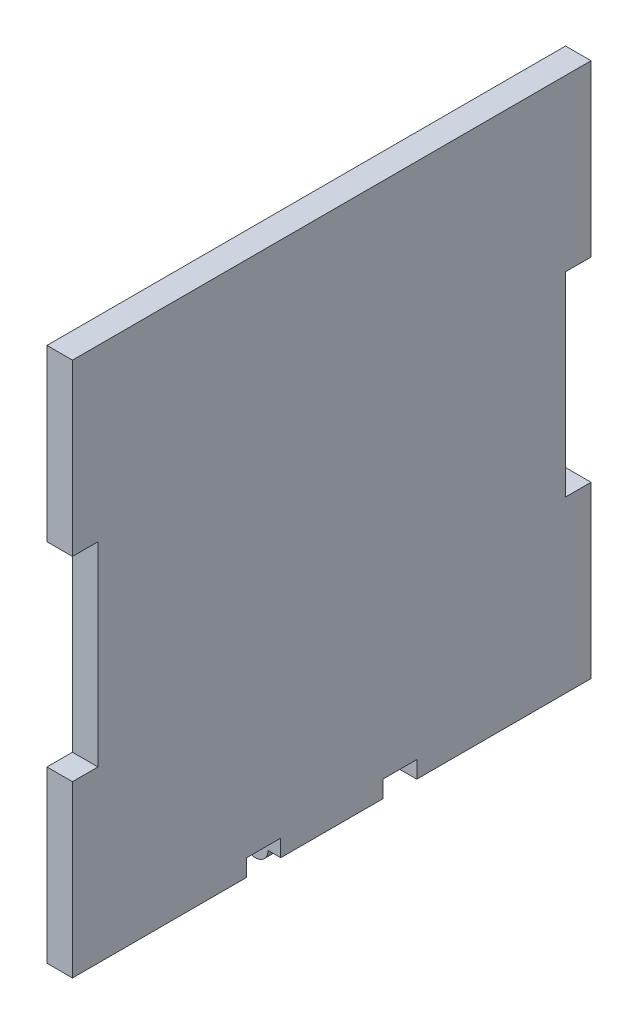
ISO-10303-21;
HEADER;
FILE_DESCRIPTION(('STEP AP214'),'2;1');
FILE_NAME('part.step','',(''),(''),'','','');
FILE_SCHEMA(('AUTOMOTIVE_DESIGN { 1 0 10303 214 1 1 1 1 }'));
ENDSEC;
DATA;
#1=APPLICATION_CONTEXT('core data for automotive mechanical design processes');
#2=APPLICATION_PROTOCOL_DEFINITION('international standard','automotive_design',2000,#1);
#3=PRODUCT_CONTEXT('',#1,'mechanical');
#4=PRODUCT('Part','Part','',(#3));
#5=PRODUCT_RELATED_PRODUCT_CATEGORY('part','',(#4));
#6=PRODUCT_DEFINITION_FORMATION('','',#4);
#7=PRODUCT_DEFINITION_CONTEXT('part definition',#1,'design');
#8=PRODUCT_DEFINITION('design','',#6,#7);
#9=PRODUCT_DEFINITION_SHAPE('','',#8);
#10=(LENGTH_UNIT() NAMED_UNIT(*) SI_UNIT(.MILLI.,.METRE.));
#11=(NAMED_UNIT(*) PLANE_ANGLE_UNIT() SI_UNIT($,.RADIAN.));
#12=(NAMED_UNIT(*) SI_UNIT($,.STERADIAN.) SOLID_ANGLE_UNIT());
#13=UNCERTAINTY_MEASURE_WITH_UNIT(LENGTH_MEASURE(1.E-05),#10,'distance_accuracy_value','');
#14=(GEOMETRIC_REPRESENTATION_CONTEXT(3) GLOBAL_UNCERTAINTY_ASSIGNED_CONTEXT((#13)) GLOBAL_UNIT_ASSIGNED_CONTEXT((#10,
#11,#12)) REPRESENTATION_CONTEXT('',''));
#15=CARTESIAN_POINT('',(0.,0.,0.));
#16=DIRECTION('',(0.,0.,1.));
#17=DIRECTION('',(1.,0.,0.));
#18=AXIS2_PLACEMENT_3D('',#15,#16,#17);
#19=CARTESIAN_POINT('',(3.,0.,27.5));
#20=DIRECTION('',(0.,1.,0.));
#21=DIRECTION('',(0.,0.,1.));
#22=AXIS2_PLACEMENT_3D('',#19,#20,#21);
#23=PLANE('',#22);
#24=DIRECTION('',(0.,0.,-1.));
#25=VECTOR('',#24,1.);
#26=CARTESIAN_POINT('',(1.49999999999999,0.,-3.));
#27=LINE('',#26,#25);
#28=CARTESIAN_POINT('',(1.49999999999999,0.,-6.));
#29=VERTEX_POINT('',#28);
#30=CARTESIAN_POINT('',(1.49999999999999,0.,-3.));
#31=VERTEX_POINT('',#30);
#32=EDGE_CURVE('E195',#29,#31,#27,.F.);
#33=ORIENTED_EDGE('',*,*,#32,.F.);
#34=DIRECTION('',(-1.,0.,0.));
#35=VECTOR('',#34,1.);
#36=CARTESIAN_POINT('',(10.,0.,-6.));
#37=LINE('',#36,#35);
#38=CARTESIAN_POINT('',(3.,0.,-6.));
#39=VERTEX_POINT('',#38);
#40=EDGE_CURVE('E249',#39,#29,#37,.T.);
#41=ORIENTED_EDGE('',*,*,#40,.F.);
#42=DIRECTION('',(0.,0.,-1.));
#43=VECTOR('',#42,1.);
#44=CARTESIAN_POINT('',(3.,0.,-27.5));
#45=LINE('',#44,#43);
#46=CARTESIAN_POINT('',(3.,0.,6.));
#47=VERTEX_POINT('',#46);
#48=EDGE_CURVE('E273',#47,#39,#45,.T.);
#49=ORIENTED_EDGE('',*,*,#48,.F.);
#50=DIRECTION('',(-1.,0.,0.));
#51=VECTOR('',#50,1.);
#52=CARTESIAN_POINT('',(10.,0.,6.));
#53=LINE('',#52,#51);
#54=CARTESIAN_POINT('',(1.49999999999999,0.,6.));
#55=VERTEX_POINT('',#54);
#56=EDGE_CURVE('E222',#47,#55,#53,.T.);
#57=ORIENTED_EDGE('',*,*,#56,.T.);
#58=DIRECTION('',(0.,0.,-1.));
#59=VECTOR('',#58,1.);
#60=CARTESIAN_POINT('',(1.49999999999999,0.,6.));
#61=LINE('',#60,#59);
#62=CARTESIAN_POINT('',(1.49999999999999,0.,3.));
#63=VERTEX_POINT('',#62);
#64=EDGE_CURVE('E56',#63,#55,#61,.F.);
#65=ORIENTED_EDGE('',*,*,#64,.F.);
#66=DIRECTION('',(1.,0.,0.));
#67=VECTOR('',#66,1.);
#68=CARTESIAN_POINT('',(3.,0.,3.));
#69=LINE('',#68,#67);
#70=CARTESIAN_POINT('',(0.,0.,3.));
#71=VERTEX_POINT('',#70);
#72=EDGE_CURVE('E263',#71,#63,#69,.T.);
#73=ORIENTED_EDGE('',*,*,#72,.F.);
#74=DIRECTION('',(0.,0.,-1.));
#75=VECTOR('',#74,1.);
#76=CARTESIAN_POINT('',(0.,0.,27.5));
#77=LINE('',#76,#75);
#78=CARTESIAN_POINT('',(0.,0.,-3.));
#79=VERTEX_POINT('',#78);
#80=EDGE_CURVE('E209',#71,#79,#77,.T.);
#81=ORIENTED_EDGE('',*,*,#80,.T.);
#82=DIRECTION('',(1.,0.,0.));
#83=VECTOR('',#82,1.);
#84=CARTESIAN_POINT('',(3.,0.,-3.));
#85=LINE('',#84,#83);
#86=EDGE_CURVE('E202',#79,#31,#85,.T.);
#87=ORIENTED_EDGE('',*,*,#86,.T.);
#88=EDGE_LOOP('',(#33,#41,#49,#57,#65,#73,#81,#87));
#89=FACE_BOUND('',#88,.T.);
#90=ADVANCED_FACE('F33',(#89),#23,.F.);
#91=CARTESIAN_POINT('',(0.,0.,0.));
#92=DIRECTION('',(1.,0.,0.));
#93=DIRECTION('',(0.,0.,-1.));
#94=AXIS2_PLACEMENT_3D('',#91,#92,#93);
#95=PLANE('',#94);
#96=DIRECTION('',(0.,0.,-1.));
#97=VECTOR('',#96,1.);
#98=CARTESIAN_POINT('',(0.,1.5,-3.));
#99=LINE('',#98,#97);
#100=CARTESIAN_POINT('',(0.,1.5,-3.));
#101=VERTEX_POINT('',#100);
#102=CARTESIAN_POINT('',(0.,1.5,-6.));
#103=VERTEX_POINT('',#102);
#104=EDGE_CURVE('E203',#101,#103,#99,.T.);
#105=ORIENTED_EDGE('',*,*,#104,.F.);
#106=DIRECTION('',(0.,-1.,0.));
#107=VECTOR('',#106,1.);
#108=CARTESIAN_POINT('',(0.,0.,-3.));
#109=LINE('',#108,#107);
#110=EDGE_CURVE('E11',#101,#79,#109,.T.);
#111=ORIENTED_EDGE('',*,*,#110,.T.);
#112=ORIENTED_EDGE('',*,*,#80,.F.);
#113=DIRECTION('',(0.,-1.,0.));
#114=VECTOR('',#113,1.);
#115=CARTESIAN_POINT('',(0.,0.,3.));
#116=LINE('',#115,#114);
#117=CARTESIAN_POINT('',(0.,1.5,3.));
#118=VERTEX_POINT('',#117);
#119=EDGE_CURVE('E360',#118,#71,#116,.T.);
#120=ORIENTED_EDGE('',*,*,#119,.F.);
#121=DIRECTION('',(0.,0.,-1.));
#122=VECTOR('',#121,1.);
#123=CARTESIAN_POINT('',(0.,1.5,6.));
#124=LINE('',#123,#122);
#125=CARTESIAN_POINT('',(0.,1.5,6.));
#126=VERTEX_POINT('',#125);
#127=EDGE_CURVE('E41',#126,#118,#124,.T.);
#128=ORIENTED_EDGE('',*,*,#127,.F.);
#129=DIRECTION('',(0.,-1.,0.));
#130=VECTOR('',#129,1.);
#131=CARTESIAN_POINT('',(0.,0.,6.));
#132=LINE('',#131,#130);
#133=CARTESIAN_POINT('',(0.,2.,6.));
#134=VERTEX_POINT('',#133);
#135=EDGE_CURVE('E219',#134,#126,#132,.T.);
#136=ORIENTED_EDGE('',*,*,#135,.F.);
#137=DIRECTION('',(0.,0.,-1.));
#138=VECTOR('',#137,1.);
#139=CARTESIAN_POINT('',(0.,2.,10.));
#140=LINE('',#139,#138);
#141=CARTESIAN_POINT('',(0.,2.,10.));
#142=VERTEX_POINT('',#141);
#143=EDGE_CURVE('E213',#142,#134,#140,.T.);
#144=ORIENTED_EDGE('',*,*,#143,.F.);
#145=DIRECTION('',(0.,1.,0.));
#146=VECTOR('',#145,1.);
#147=CARTESIAN_POINT('',(0.,0.,10.));
#148=LINE('',#147,#146);
#149=CARTESIAN_POINT('',(0.,0.,10.));
#150=VERTEX_POINT('',#149);
#151=EDGE_CURVE('E210',#150,#142,#148,.T.);
#152=ORIENTED_EDGE('',*,*,#151,.F.);
#153=CARTESIAN_POINT('',(0.,0.,30.5));
#154=VERTEX_POINT('',#153);
#155=EDGE_CURVE('E322',#154,#150,#77,.T.);
#156=ORIENTED_EDGE('',*,*,#155,.F.);
#157=DIRECTION('',(0.,-1.,0.));
#158=VECTOR('',#157,1.);
#159=CARTESIAN_POINT('',(0.,0.,30.5));
#160=LINE('',#159,#158);
#161=CARTESIAN_POINT('',(0.,20.,30.5));
#162=VERTEX_POINT('',#161);
#163=EDGE_CURVE('E318',#162,#154,#160,.T.);
#164=ORIENTED_EDGE('',*,*,#163,.F.);
#165=DIRECTION('',(0.,0.,1.));
#166=VECTOR('',#165,1.);
#167=CARTESIAN_POINT('',(0.,20.,27.5));
#168=LINE('',#167,#166);
#169=CARTESIAN_POINT('',(0.,20.,27.5));
#170=VERTEX_POINT('',#169);
#171=EDGE_CURVE('E316',#170,#162,#168,.T.);
#172=ORIENTED_EDGE('',*,*,#171,.F.);
#173=DIRECTION('',(0.,-1.,0.));
#174=VECTOR('',#173,1.);
#175=CARTESIAN_POINT('',(0.,20.,27.5));
#176=LINE('',#175,#174);
#177=CARTESIAN_POINT('',(0.,42.94,27.5));
#178=VERTEX_POINT('',#177);
#179=EDGE_CURVE('E314',#178,#170,#176,.T.);
#180=ORIENTED_EDGE('',*,*,#179,.F.);
#181=DIRECTION('',(0.,0.,-1.));
#182=VECTOR('',#181,1.);
#183=CARTESIAN_POINT('',(0.,42.94,30.5));
#184=LINE('',#183,#182);
#185=CARTESIAN_POINT('',(0.,42.94,30.5));
#186=VERTEX_POINT('',#185);
#187=EDGE_CURVE('E312',#186,#178,#184,.T.);
#188=ORIENTED_EDGE('',*,*,#187,.F.);
#189=DIRECTION('',(0.,-1.,0.));
#190=VECTOR('',#189,1.);
#191=CARTESIAN_POINT('',(0.,42.94,30.5));
#192=LINE('',#191,#190);
#193=CARTESIAN_POINT('',(0.,62.94,30.5));
#194=VERTEX_POINT('',#193);
#195=EDGE_CURVE('E310',#194,#186,#192,.T.);
#196=ORIENTED_EDGE('',*,*,#195,.F.);
#197=DIRECTION('',(0.,0.,1.));
#198=VECTOR('',#197,1.);
#199=CARTESIAN_POINT('',(0.,62.94,30.5));
#200=LINE('',#199,#198);
#201=CARTESIAN_POINT('',(0.,62.94,-30.5));
#202=VERTEX_POINT('',#201);
#203=EDGE_CURVE('E308',#202,#194,#200,.T.);
#204=ORIENTED_EDGE('',*,*,#203,.F.);
#205=DIRECTION('',(0.,1.,0.));
#206=VECTOR('',#205,1.);
#207=CARTESIAN_POINT('',(0.,42.94,-30.5));
#208=LINE('',#207,#206);
#209=CARTESIAN_POINT('',(0.,42.94,-30.5));
#210=VERTEX_POINT('',#209);
#211=EDGE_CURVE('E305',#210,#202,#208,.T.);
#212=ORIENTED_EDGE('',*,*,#211,.F.);
#213=DIRECTION('',(0.,0.,-1.));
#214=VECTOR('',#213,1.);
#215=CARTESIAN_POINT('',(0.,42.94,-30.5));
#216=LINE('',#215,#214);
#217=CARTESIAN_POINT('',(0.,42.94,-27.5));
#218=VERTEX_POINT('',#217);
#219=EDGE_CURVE('E303',#218,#210,#216,.T.);
#220=ORIENTED_EDGE('',*,*,#219,.F.);
#221=DIRECTION('',(0.,1.,0.));
#222=VECTOR('',#221,1.);
#223=CARTESIAN_POINT('',(0.,20.,-27.5));
#224=LINE('',#223,#222);
#225=CARTESIAN_POINT('',(0.,20.,-27.5));
#226=VERTEX_POINT('',#225);
#227=EDGE_CURVE('E301',#226,#218,#224,.T.);
#228=ORIENTED_EDGE('',*,*,#227,.F.);
#229=DIRECTION('',(0.,0.,1.));
#230=VECTOR('',#229,1.);
#231=CARTESIAN_POINT('',(0.,20.,-27.5));
#232=LINE('',#231,#230);
#233=CARTESIAN_POINT('',(0.,20.,-30.5));
#234=VERTEX_POINT('',#233);
#235=EDGE_CURVE('E299',#234,#226,#232,.T.);
#236=ORIENTED_EDGE('',*,*,#235,.F.);
#237=DIRECTION('',(0.,1.,0.));
#238=VECTOR('',#237,1.);
#239=CARTESIAN_POINT('',(0.,0.,-30.5));
#240=LINE('',#239,#238);
#241=CARTESIAN_POINT('',(0.,0.,-30.5));
#242=VERTEX_POINT('',#241);
#243=EDGE_CURVE('E268',#242,#234,#240,.T.);
#244=ORIENTED_EDGE('',*,*,#243,.F.);
#245=CARTESIAN_POINT('',(0.,0.,-10.));
#246=VERTEX_POINT('',#245);
#247=EDGE_CURVE('E321',#246,#242,#77,.T.);
#248=ORIENTED_EDGE('',*,*,#247,.F.);
#249=DIRECTION('',(0.,-1.,0.));
#250=VECTOR('',#249,1.);
#251=CARTESIAN_POINT('',(0.,0.,-10.));
#252=LINE('',#251,#250);
#253=CARTESIAN_POINT('',(0.,2.,-10.));
#254=VERTEX_POINT('',#253);
#255=EDGE_CURVE('E235',#254,#246,#252,.T.);
#256=ORIENTED_EDGE('',*,*,#255,.F.);
#257=DIRECTION('',(0.,0.,-1.));
#258=VECTOR('',#257,1.);
#259=CARTESIAN_POINT('',(0.,2.,-10.));
#260=LINE('',#259,#258);
#261=CARTESIAN_POINT('',(0.,2.,-6.));
#262=VERTEX_POINT('',#261);
#263=EDGE_CURVE('E239',#262,#254,#260,.T.);
#264=ORIENTED_EDGE('',*,*,#263,.F.);
#265=DIRECTION('',(0.,1.,0.));
#266=VECTOR('',#265,1.);
#267=CARTESIAN_POINT('',(0.,0.,-6.));
#268=LINE('',#267,#266);
#269=EDGE_CURVE('E237',#103,#262,#268,.T.);
#270=ORIENTED_EDGE('',*,*,#269,.F.);
#271=EDGE_LOOP('',(#105,#111,#112,#120,#128,#136,#144,#152,#156,#164,#172,#180,#188,#196,#204,
#212,#220,#228,#236,#244,#248,#256,#264,#270));
#272=FACE_BOUND('',#271,.T.);
#273=ADVANCED_FACE('F372',(#272),#95,.F.);
#274=CARTESIAN_POINT('',(3.,0.,-10.));
#275=VERTEX_POINT('',#274);
#276=CARTESIAN_POINT('',(3.,0.,-30.5));
#277=VERTEX_POINT('',#276);
#278=EDGE_CURVE('E274',#275,#277,#45,.T.);
#279=ORIENTED_EDGE('',*,*,#278,.F.);
#280=DIRECTION('',(-1.,0.,0.));
#281=VECTOR('',#280,1.);
#282=CARTESIAN_POINT('',(10.,0.,-10.));
#283=LINE('',#282,#281);
#284=EDGE_CURVE('E242',#275,#246,#283,.T.);
#285=ORIENTED_EDGE('',*,*,#284,.T.);
#286=ORIENTED_EDGE('',*,*,#247,.T.);
#287=DIRECTION('',(-1.,0.,0.));
#288=VECTOR('',#287,1.);
#289=CARTESIAN_POINT('',(3.,0.,-30.5));
#290=LINE('',#289,#288);
#291=EDGE_CURVE('E357',#277,#242,#290,.T.);
#292=ORIENTED_EDGE('',*,*,#291,.F.);
#293=EDGE_LOOP('',(#279,#285,#286,#292));
#294=FACE_BOUND('',#293,.T.);
#295=ADVANCED_FACE('F378',(#294),#23,.F.);
#296=CARTESIAN_POINT('',(3.,0.,-30.5));
#297=DIRECTION('',(0.,0.,1.));
#298=DIRECTION('',(1.,0.,0.));
#299=AXIS2_PLACEMENT_3D('',#296,#297,#298);
#300=PLANE('',#299);
#301=ORIENTED_EDGE('',*,*,#243,.T.);
#302=DIRECTION('',(-1.,0.,0.));
#303=VECTOR('',#302,1.);
#304=CARTESIAN_POINT('',(3.,20.,-30.5));
#305=LINE('',#304,#303);
#306=CARTESIAN_POINT('',(3.,20.,-30.5));
#307=VERTEX_POINT('',#306);
#308=EDGE_CURVE('E354',#307,#234,#305,.T.);
#309=ORIENTED_EDGE('',*,*,#308,.F.);
#310=DIRECTION('',(0.,1.,0.));
#311=VECTOR('',#310,1.);
#312=CARTESIAN_POINT('',(3.,0.,-30.5));
#313=LINE('',#312,#311);
#314=EDGE_CURVE('E272',#277,#307,#313,.T.);
#315=ORIENTED_EDGE('',*,*,#314,.F.);
#316=ORIENTED_EDGE('',*,*,#291,.T.);
#317=EDGE_LOOP('',(#301,#309,#315,#316));
#318=FACE_BOUND('',#317,.T.);
#319=ADVANCED_FACE('F35',(#318),#300,.F.);
#320=CARTESIAN_POINT('',(3.,20.,-27.5));
#321=DIRECTION('',(0.,-1.,0.));
#322=DIRECTION('',(0.,0.,-1.));
#323=AXIS2_PLACEMENT_3D('',#320,#321,#322);
#324=PLANE('',#323);
#325=ORIENTED_EDGE('',*,*,#235,.T.);
#326=DIRECTION('',(-1.,0.,0.));
#327=VECTOR('',#326,1.);
#328=CARTESIAN_POINT('',(3.,20.,-27.5));
#329=LINE('',#328,#327);
#330=CARTESIAN_POINT('',(3.,20.,-27.5));
#331=VERTEX_POINT('',#330);
#332=EDGE_CURVE('E351',#331,#226,#329,.T.);
#333=ORIENTED_EDGE('',*,*,#332,.F.);
#334=DIRECTION('',(0.,0.,1.));
#335=VECTOR('',#334,1.);
#336=CARTESIAN_POINT('',(3.,20.,-27.5));
#337=LINE('',#336,#335);
#338=EDGE_CURVE('E276',#307,#331,#337,.T.);
#339=ORIENTED_EDGE('',*,*,#338,.F.);
#340=ORIENTED_EDGE('',*,*,#308,.T.);
#341=EDGE_LOOP('',(#325,#333,#339,#340));
#342=FACE_BOUND('',#341,.T.);
#343=ADVANCED_FACE('F478',(#342),#324,.F.);
#344=CARTESIAN_POINT('',(3.,20.,-27.5));
#345=DIRECTION('',(0.,0.,1.));
#346=DIRECTION('',(1.,0.,0.));
#347=AXIS2_PLACEMENT_3D('',#344,#345,#346);
#348=PLANE('',#347);
#349=ORIENTED_EDGE('',*,*,#227,.T.);
#350=DIRECTION('',(-1.,0.,0.));
#351=VECTOR('',#350,1.);
#352=CARTESIAN_POINT('',(3.,42.94,-27.5));
#353=LINE('',#352,#351);
#354=CARTESIAN_POINT('',(3.,42.94,-27.5));
#355=VERTEX_POINT('',#354);
#356=EDGE_CURVE('E348',#355,#218,#353,.T.);
#357=ORIENTED_EDGE('',*,*,#356,.F.);
#358=DIRECTION('',(0.,1.,0.));
#359=VECTOR('',#358,1.);
#360=CARTESIAN_POINT('',(3.,20.,-27.5));
#361=LINE('',#360,#359);
#362=EDGE_CURVE('E278',#331,#355,#361,.T.);
#363=ORIENTED_EDGE('',*,*,#362,.F.);
#364=ORIENTED_EDGE('',*,*,#332,.T.);
#365=EDGE_LOOP('',(#349,#357,#363,#364));
#366=FACE_BOUND('',#365,.T.);
#367=ADVANCED_FACE('F476',(#366),#348,.F.);
#368=CARTESIAN_POINT('',(3.,42.94,-30.5));
#369=DIRECTION('',(0.,1.,0.));
#370=DIRECTION('',(0.,0.,1.));
#371=AXIS2_PLACEMENT_3D('',#368,#369,#370);
#372=PLANE('',#371);
#373=ORIENTED_EDGE('',*,*,#219,.T.);
#374=DIRECTION('',(-1.,0.,0.));
#375=VECTOR('',#374,1.);
#376=CARTESIAN_POINT('',(3.,42.94,-30.5));
#377=LINE('',#376,#375);
#378=CARTESIAN_POINT('',(3.,42.94,-30.5));
#379=VERTEX_POINT('',#378);
#380=EDGE_CURVE('E345',#379,#210,#377,.T.);
#381=ORIENTED_EDGE('',*,*,#380,.F.);
#382=DIRECTION('',(0.,0.,-1.));
#383=VECTOR('',#382,1.);
#384=CARTESIAN_POINT('',(3.,42.94,-30.5));
#385=LINE('',#384,#383);
#386=EDGE_CURVE('E280',#355,#379,#385,.T.);
#387=ORIENTED_EDGE('',*,*,#386,.F.);
#388=ORIENTED_EDGE('',*,*,#356,.T.);
#389=EDGE_LOOP('',(#373,#381,#387,#388));
#390=FACE_BOUND('',#389,.T.);
#391=ADVANCED_FACE('F474',(#390),#372,.F.);
#392=CARTESIAN_POINT('',(3.,42.94,-30.5));
#393=DIRECTION('',(0.,0.,1.));
#394=DIRECTION('',(1.,0.,0.));
#395=AXIS2_PLACEMENT_3D('',#392,#393,#394);
#396=PLANE('',#395);
#397=ORIENTED_EDGE('',*,*,#211,.T.);
#398=DIRECTION('',(-1.,0.,0.));
#399=VECTOR('',#398,1.);
#400=CARTESIAN_POINT('',(3.,62.94,-30.5));
#401=LINE('',#400,#399);
#402=CARTESIAN_POINT('',(3.,62.94,-30.5));
#403=VERTEX_POINT('',#402);
#404=EDGE_CURVE('E342',#403,#202,#401,.T.);
#405=ORIENTED_EDGE('',*,*,#404,.F.);
#406=DIRECTION('',(0.,1.,0.));
#407=VECTOR('',#406,1.);
#408=CARTESIAN_POINT('',(3.,42.94,-30.5));
#409=LINE('',#408,#407);
#410=EDGE_CURVE('E282',#379,#403,#409,.T.);
#411=ORIENTED_EDGE('',*,*,#410,.F.);
#412=ORIENTED_EDGE('',*,*,#380,.T.);
#413=EDGE_LOOP('',(#397,#405,#411,#412));
#414=FACE_BOUND('',#413,.T.);
#415=ADVANCED_FACE('F465',(#414),#396,.F.);
#416=CARTESIAN_POINT('',(3.,62.94,30.5));
#417=DIRECTION('',(0.,-1.,0.));
#418=DIRECTION('',(0.,0.,-1.));
#419=AXIS2_PLACEMENT_3D('',#416,#417,#418);
#420=PLANE('',#419);
#421=ORIENTED_EDGE('',*,*,#203,.T.);
#422=DIRECTION('',(-1.,0.,0.));
#423=VECTOR('',#422,1.);
#424=CARTESIAN_POINT('',(3.,62.94,30.5));
#425=LINE('',#424,#423);
#426=CARTESIAN_POINT('',(3.,62.94,30.5));
#427=VERTEX_POINT('',#426);
#428=EDGE_CURVE('E339',#427,#194,#425,.T.);
#429=ORIENTED_EDGE('',*,*,#428,.F.);
#430=DIRECTION('',(0.,0.,1.));
#431=VECTOR('',#430,1.);
#432=CARTESIAN_POINT('',(3.,62.94,-30.5));
#433=LINE('',#432,#431);
#434=EDGE_CURVE('E284',#403,#427,#433,.T.);
#435=ORIENTED_EDGE('',*,*,#434,.F.);
#436=ORIENTED_EDGE('',*,*,#404,.T.);
#437=EDGE_LOOP('',(#421,#429,#435,#436));
#438=FACE_BOUND('',#437,.T.);
#439=ADVANCED_FACE('F469',(#438),#420,.F.);
#440=CARTESIAN_POINT('',(3.,42.94,30.5));
#441=DIRECTION('',(0.,0.,-1.));
#442=DIRECTION('',(0.,1.,0.));
#443=AXIS2_PLACEMENT_3D('',#440,#441,#442);
#444=PLANE('',#443);
#445=ORIENTED_EDGE('',*,*,#195,.T.);
#446=DIRECTION('',(-1.,0.,0.));
#447=VECTOR('',#446,1.);
#448=CARTESIAN_POINT('',(3.,42.94,30.5));
#449=LINE('',#448,#447);
#450=CARTESIAN_POINT('',(3.,42.94,30.5));
#451=VERTEX_POINT('',#450);
#452=EDGE_CURVE('E336',#451,#186,#449,.T.);
#453=ORIENTED_EDGE('',*,*,#452,.F.);
#454=DIRECTION('',(0.,-1.,0.));
#455=VECTOR('',#454,1.);
#456=CARTESIAN_POINT('',(3.,42.94,30.5));
#457=LINE('',#456,#455);
#458=EDGE_CURVE('E286',#427,#451,#457,.T.);
#459=ORIENTED_EDGE('',*,*,#458,.F.);
#460=ORIENTED_EDGE('',*,*,#428,.T.);
#461=EDGE_LOOP('',(#445,#453,#459,#460));
#462=FACE_BOUND('',#461,.T.);
#463=ADVANCED_FACE('F458',(#462),#444,.F.);
#464=CARTESIAN_POINT('',(3.,42.94,30.5));
#465=DIRECTION('',(0.,1.,0.));
#466=DIRECTION('',(0.,0.,1.));
#467=AXIS2_PLACEMENT_3D('',#464,#465,#466);
#468=PLANE('',#467);
#469=ORIENTED_EDGE('',*,*,#187,.T.);
#470=DIRECTION('',(-1.,0.,0.));
#471=VECTOR('',#470,1.);
#472=CARTESIAN_POINT('',(3.,42.94,27.5));
#473=LINE('',#472,#471);
#474=CARTESIAN_POINT('',(3.,42.94,27.5));
#475=VERTEX_POINT('',#474);
#476=EDGE_CURVE('E333',#475,#178,#473,.T.);
#477=ORIENTED_EDGE('',*,*,#476,.F.);
#478=DIRECTION('',(0.,0.,-1.));
#479=VECTOR('',#478,1.);
#480=CARTESIAN_POINT('',(3.,42.94,30.5));
#481=LINE('',#480,#479);
#482=EDGE_CURVE('E288',#451,#475,#481,.T.);
#483=ORIENTED_EDGE('',*,*,#482,.F.);
#484=ORIENTED_EDGE('',*,*,#452,.T.);
#485=EDGE_LOOP('',(#469,#477,#483,#484));
#486=FACE_BOUND('',#485,.T.);
#487=ADVANCED_FACE('F454',(#486),#468,.F.);
#488=CARTESIAN_POINT('',(3.,20.,27.5));
#489=DIRECTION('',(0.,0.,-1.));
#490=DIRECTION('',(0.,1.,0.));
#491=AXIS2_PLACEMENT_3D('',#488,#489,#490);
#492=PLANE('',#491);
#493=ORIENTED_EDGE('',*,*,#179,.T.);
#494=DIRECTION('',(-1.,0.,0.));
#495=VECTOR('',#494,1.);
#496=CARTESIAN_POINT('',(3.,20.,27.5));
#497=LINE('',#496,#495);
#498=CARTESIAN_POINT('',(3.,20.,27.5));
#499=VERTEX_POINT('',#498);
#500=EDGE_CURVE('E330',#499,#170,#497,.T.);
#501=ORIENTED_EDGE('',*,*,#500,.F.);
#502=DIRECTION('',(0.,-1.,0.));
#503=VECTOR('',#502,1.);
#504=CARTESIAN_POINT('',(3.,20.,27.5));
#505=LINE('',#504,#503);
#506=EDGE_CURVE('E290',#475,#499,#505,.T.);
#507=ORIENTED_EDGE('',*,*,#506,.F.);
#508=ORIENTED_EDGE('',*,*,#476,.T.);
#509=EDGE_LOOP('',(#493,#501,#507,#508));
#510=FACE_BOUND('',#509,.T.);
#511=ADVANCED_FACE('F449',(#510),#492,.F.);
#512=CARTESIAN_POINT('',(3.,20.,27.5));
#513=DIRECTION('',(0.,-1.,0.));
#514=DIRECTION('',(0.,0.,-1.));
#515=AXIS2_PLACEMENT_3D('',#512,#513,#514);
#516=PLANE('',#515);
#517=ORIENTED_EDGE('',*,*,#171,.T.);
#518=DIRECTION('',(-1.,0.,0.));
#519=VECTOR('',#518,1.);
#520=CARTESIAN_POINT('',(3.,20.,30.5));
#521=LINE('',#520,#519);
#522=CARTESIAN_POINT('',(3.,20.,30.5));
#523=VERTEX_POINT('',#522);
#524=EDGE_CURVE('E327',#523,#162,#521,.T.);
#525=ORIENTED_EDGE('',*,*,#524,.F.);
#526=DIRECTION('',(0.,0.,1.));
#527=VECTOR('',#526,1.);
#528=CARTESIAN_POINT('',(3.,20.,27.5));
#529=LINE('',#528,#527);
#530=EDGE_CURVE('E292',#499,#523,#529,.T.);
#531=ORIENTED_EDGE('',*,*,#530,.F.);
#532=ORIENTED_EDGE('',*,*,#500,.T.);
#533=EDGE_LOOP('',(#517,#525,#531,#532));
#534=FACE_BOUND('',#533,.T.);
#535=ADVANCED_FACE('F432',(#534),#516,.F.);
#536=CARTESIAN_POINT('',(3.,0.,30.5));
#537=DIRECTION('',(0.,0.,-1.));
#538=DIRECTION('',(-1.,0.,0.));
#539=AXIS2_PLACEMENT_3D('',#536,#537,#538);
#540=PLANE('',#539);
#541=ORIENTED_EDGE('',*,*,#163,.T.);
#542=DIRECTION('',(-1.,0.,0.));
#543=VECTOR('',#542,1.);
#544=CARTESIAN_POINT('',(3.,0.,30.5));
#545=LINE('',#544,#543);
#546=CARTESIAN_POINT('',(3.,0.,30.5));
#547=VERTEX_POINT('',#546);
#548=EDGE_CURVE('E297',#547,#154,#545,.T.);
#549=ORIENTED_EDGE('',*,*,#548,.F.);
#550=DIRECTION('',(0.,-1.,0.));
#551=VECTOR('',#550,1.);
#552=CARTESIAN_POINT('',(3.,0.,30.5));
#553=LINE('',#552,#551);
#554=EDGE_CURVE('E294',#523,#547,#553,.T.);
#555=ORIENTED_EDGE('',*,*,#554,.F.);
#556=ORIENTED_EDGE('',*,*,#524,.T.);
#557=EDGE_LOOP('',(#541,#549,#555,#556));
#558=FACE_BOUND('',#557,.T.);
#559=ADVANCED_FACE('F425',(#558),#540,.F.);
#560=ORIENTED_EDGE('',*,*,#155,.T.);
#561=DIRECTION('',(-1.,0.,0.));
#562=VECTOR('',#561,1.);
#563=CARTESIAN_POINT('',(10.,0.,10.));
#564=LINE('',#563,#562);
#565=CARTESIAN_POINT('',(3.,0.,10.));
#566=VERTEX_POINT('',#565);
#567=EDGE_CURVE('E221',#566,#150,#564,.T.);
#568=ORIENTED_EDGE('',*,*,#567,.F.);
#569=EDGE_CURVE('E269',#547,#566,#45,.T.);
#570=ORIENTED_EDGE('',*,*,#569,.F.);
#571=ORIENTED_EDGE('',*,*,#548,.T.);
#572=EDGE_LOOP('',(#560,#568,#570,#571));
#573=FACE_BOUND('',#572,.T.);
#574=ADVANCED_FACE('F417',(#573),#23,.F.);
#575=CARTESIAN_POINT('',(3.,0.,0.));
#576=DIRECTION('',(1.,0.,0.));
#577=DIRECTION('',(0.,0.,-1.));
#578=AXIS2_PLACEMENT_3D('',#575,#576,#577);
#579=PLANE('',#578);
#580=DIRECTION('',(0.,1.,0.));
#581=VECTOR('',#580,1.);
#582=CARTESIAN_POINT('',(3.,0.,6.));
#583=LINE('',#582,#581);
#584=CARTESIAN_POINT('',(3.,2.,6.));
#585=VERTEX_POINT('',#584);
#586=EDGE_CURVE('E224',#47,#585,#583,.T.);
#587=ORIENTED_EDGE('',*,*,#586,.F.);
#588=ORIENTED_EDGE('',*,*,#48,.T.);
#589=DIRECTION('',(0.,-1.,0.));
#590=VECTOR('',#589,1.);
#591=CARTESIAN_POINT('',(3.,0.,-6.));
#592=LINE('',#591,#590);
#593=CARTESIAN_POINT('',(3.,2.,-6.));
#594=VERTEX_POINT('',#593);
#595=EDGE_CURVE('E245',#594,#39,#592,.T.);
#596=ORIENTED_EDGE('',*,*,#595,.F.);
#597=DIRECTION('',(0.,0.,1.));
#598=VECTOR('',#597,1.);
#599=CARTESIAN_POINT('',(3.,2.,0.));
#600=LINE('',#599,#598);
#601=CARTESIAN_POINT('',(3.,2.,-10.));
#602=VERTEX_POINT('',#601);
#603=EDGE_CURVE('E255',#602,#594,#600,.T.);
#604=ORIENTED_EDGE('',*,*,#603,.F.);
#605=DIRECTION('',(0.,1.,0.));
#606=VECTOR('',#605,1.);
#607=CARTESIAN_POINT('',(3.,0.,-10.));
#608=LINE('',#607,#606);
#609=EDGE_CURVE('E257',#275,#602,#608,.T.);
#610=ORIENTED_EDGE('',*,*,#609,.F.);
#611=ORIENTED_EDGE('',*,*,#278,.T.);
#612=ORIENTED_EDGE('',*,*,#314,.T.);
#613=ORIENTED_EDGE('',*,*,#338,.T.);
#614=ORIENTED_EDGE('',*,*,#362,.T.);
#615=ORIENTED_EDGE('',*,*,#386,.T.);
#616=ORIENTED_EDGE('',*,*,#410,.T.);
#617=ORIENTED_EDGE('',*,*,#434,.T.);
#618=ORIENTED_EDGE('',*,*,#458,.T.);
#619=ORIENTED_EDGE('',*,*,#482,.T.);
#620=ORIENTED_EDGE('',*,*,#506,.T.);
#621=ORIENTED_EDGE('',*,*,#530,.T.);
#622=ORIENTED_EDGE('',*,*,#554,.T.);
#623=ORIENTED_EDGE('',*,*,#569,.T.);
#624=DIRECTION('',(0.,-1.,0.));
#625=VECTOR('',#624,1.);
#626=CARTESIAN_POINT('',(3.,0.,10.));
#627=LINE('',#626,#625);
#628=CARTESIAN_POINT('',(3.,2.,10.));
#629=VERTEX_POINT('',#628);
#630=EDGE_CURVE('E231',#629,#566,#627,.T.);
#631=ORIENTED_EDGE('',*,*,#630,.F.);
#632=DIRECTION('',(0.,0.,1.));
#633=VECTOR('',#632,1.);
#634=CARTESIAN_POINT('',(3.,2.,0.));
#635=LINE('',#634,#633);
#636=EDGE_CURVE('E233',#585,#629,#635,.T.);
#637=ORIENTED_EDGE('',*,*,#636,.F.);
#638=EDGE_LOOP('',(#587,#588,#596,#604,#610,#611,#612,#613,#614,#615,#616,#617,#618,#619,#620,
#621,#622,#623,#631,#637));
#639=FACE_BOUND('',#638,.T.);
#640=ADVANCED_FACE('F388',(#639),#579,.T.);
#641=CARTESIAN_POINT('',(0.,0.,6.));
#642=DIRECTION('',(0.,0.,-1.));
#643=DIRECTION('',(-1.,0.,0.));
#644=AXIS2_PLACEMENT_3D('',#641,#642,#643);
#645=CYLINDRICAL_SURFACE('',#644,1.49999999999999);
#646=CARTESIAN_POINT('',(0.,0.,3.));
#647=DIRECTION('',(0.,0.,1.));
#648=DIRECTION('',(1.,0.,0.));
#649=AXIS2_PLACEMENT_3D('',#646,#647,#648);
#650=CIRCLE('',#649,1.49999999999999);
#651=EDGE_CURVE('E259',#118,#63,#650,.T.);
#652=ORIENTED_EDGE('',*,*,#651,.T.);
#653=ORIENTED_EDGE('',*,*,#64,.T.);
#654=CARTESIAN_POINT('',(0.,0.,6.));
#655=DIRECTION('',(0.,0.,1.));
#656=DIRECTION('',(1.,0.,0.));
#657=AXIS2_PLACEMENT_3D('',#654,#655,#656);
#658=CIRCLE('',#657,1.49999999999999);
#659=EDGE_CURVE('E260',#126,#55,#658,.T.);
#660=ORIENTED_EDGE('',*,*,#659,.F.);
#661=ORIENTED_EDGE('',*,*,#127,.T.);
#662=EDGE_LOOP('',(#652,#653,#660,#661));
#663=FACE_BOUND('',#662,.T.);
#664=ADVANCED_FACE('F367',(#663),#645,.T.);
#665=CARTESIAN_POINT('',(0.,0.,6.));
#666=DIRECTION('',(0.,0.,1.));
#667=DIRECTION('',(1.,0.,0.));
#668=AXIS2_PLACEMENT_3D('',#665,#666,#667);
#669=PLANE('',#668);
#670=ORIENTED_EDGE('',*,*,#659,.T.);
#671=ORIENTED_EDGE('',*,*,#56,.F.);
#672=ORIENTED_EDGE('',*,*,#586,.T.);
#673=DIRECTION('',(-1.,0.,0.));
#674=VECTOR('',#673,1.);
#675=CARTESIAN_POINT('',(10.,2.,6.));
#676=LINE('',#675,#674);
#677=EDGE_CURVE('E225',#585,#134,#676,.T.);
#678=ORIENTED_EDGE('',*,*,#677,.T.);
#679=ORIENTED_EDGE('',*,*,#135,.T.);
#680=EDGE_LOOP('',(#670,#671,#672,#678,#679));
#681=FACE_BOUND('',#680,.T.);
#682=ADVANCED_FACE('F411',(#681),#669,.T.);
#683=CARTESIAN_POINT('',(0.,0.,3.));
#684=DIRECTION('',(0.,0.,1.));
#685=DIRECTION('',(1.,0.,0.));
#686=AXIS2_PLACEMENT_3D('',#683,#684,#685);
#687=PLANE('',#686);
#688=ORIENTED_EDGE('',*,*,#119,.T.);
#689=ORIENTED_EDGE('',*,*,#72,.T.);
#690=ORIENTED_EDGE('',*,*,#651,.F.);
#691=EDGE_LOOP('',(#688,#689,#690));
#692=FACE_BOUND('',#691,.T.);
#693=ADVANCED_FACE('F371',(#692),#687,.F.);
#694=CARTESIAN_POINT('',(10.,0.,-10.));
#695=DIRECTION('',(0.,0.,-1.));
#696=DIRECTION('',(-1.,0.,0.));
#697=AXIS2_PLACEMENT_3D('',#694,#695,#696);
#698=PLANE('',#697);
#699=ORIENTED_EDGE('',*,*,#609,.T.);
#700=DIRECTION('',(-1.,0.,0.));
#701=VECTOR('',#700,1.);
#702=CARTESIAN_POINT('',(10.,2.,-10.));
#703=LINE('',#702,#701);
#704=EDGE_CURVE('E243',#602,#254,#703,.T.);
#705=ORIENTED_EDGE('',*,*,#704,.T.);
#706=ORIENTED_EDGE('',*,*,#255,.T.);
#707=ORIENTED_EDGE('',*,*,#284,.F.);
#708=EDGE_LOOP('',(#699,#705,#706,#707));
#709=FACE_BOUND('',#708,.T.);
#710=ADVANCED_FACE('F403',(#709),#698,.F.);
#711=CARTESIAN_POINT('',(10.,2.,-10.));
#712=DIRECTION('',(0.,1.,0.));
#713=DIRECTION('',(0.,0.,1.));
#714=AXIS2_PLACEMENT_3D('',#711,#712,#713);
#715=PLANE('',#714);
#716=ORIENTED_EDGE('',*,*,#603,.T.);
#717=DIRECTION('',(-1.,0.,0.));
#718=VECTOR('',#717,1.);
#719=CARTESIAN_POINT('',(10.,2.,-6.));
#720=LINE('',#719,#718);
#721=EDGE_CURVE('E246',#594,#262,#720,.T.);
#722=ORIENTED_EDGE('',*,*,#721,.T.);
#723=ORIENTED_EDGE('',*,*,#263,.T.);
#724=ORIENTED_EDGE('',*,*,#704,.F.);
#725=EDGE_LOOP('',(#716,#722,#723,#724));
#726=FACE_BOUND('',#725,.T.);
#727=ADVANCED_FACE('F400',(#726),#715,.F.);
#728=CARTESIAN_POINT('',(10.,0.,-6.));
#729=DIRECTION('',(0.,0.,1.));
#730=DIRECTION('',(1.,0.,0.));
#731=AXIS2_PLACEMENT_3D('',#728,#729,#730);
#732=PLANE('',#731);
#733=ORIENTED_EDGE('',*,*,#40,.T.);
#734=CARTESIAN_POINT('',(0.,0.,-6.));
#735=DIRECTION('',(0.,0.,1.));
#736=DIRECTION('',(1.,0.,0.));
#737=AXIS2_PLACEMENT_3D('',#734,#735,#736);
#738=CIRCLE('',#737,1.49999999999999);
#739=EDGE_CURVE('E48',#103,#29,#738,.T.);
#740=ORIENTED_EDGE('',*,*,#739,.F.);
#741=ORIENTED_EDGE('',*,*,#269,.T.);
#742=ORIENTED_EDGE('',*,*,#721,.F.);
#743=ORIENTED_EDGE('',*,*,#595,.T.);
#744=EDGE_LOOP('',(#733,#740,#741,#742,#743));
#745=FACE_BOUND('',#744,.T.);
#746=ADVANCED_FACE('F396',(#745),#732,.F.);
#747=CARTESIAN_POINT('',(10.,2.,10.));
#748=DIRECTION('',(0.,1.,0.));
#749=DIRECTION('',(0.,0.,1.));
#750=AXIS2_PLACEMENT_3D('',#747,#748,#749);
#751=PLANE('',#750);
#752=ORIENTED_EDGE('',*,*,#636,.T.);
#753=DIRECTION('',(-1.,0.,0.));
#754=VECTOR('',#753,1.);
#755=CARTESIAN_POINT('',(10.,2.,10.));
#756=LINE('',#755,#754);
#757=EDGE_CURVE('E227',#629,#142,#756,.T.);
#758=ORIENTED_EDGE('',*,*,#757,.T.);
#759=ORIENTED_EDGE('',*,*,#143,.T.);
#760=ORIENTED_EDGE('',*,*,#677,.F.);
#761=EDGE_LOOP('',(#752,#758,#759,#760));
#762=FACE_BOUND('',#761,.T.);
#763=ADVANCED_FACE('F567',(#762),#751,.F.);
#764=CARTESIAN_POINT('',(10.,0.,10.));
#765=DIRECTION('',(0.,0.,1.));
#766=DIRECTION('',(1.,0.,0.));
#767=AXIS2_PLACEMENT_3D('',#764,#765,#766);
#768=PLANE('',#767);
#769=ORIENTED_EDGE('',*,*,#630,.T.);
#770=ORIENTED_EDGE('',*,*,#567,.T.);
#771=ORIENTED_EDGE('',*,*,#151,.T.);
#772=ORIENTED_EDGE('',*,*,#757,.F.);
#773=EDGE_LOOP('',(#769,#770,#771,#772));
#774=FACE_BOUND('',#773,.T.);
#775=ADVANCED_FACE('F572',(#774),#768,.F.);
#776=CARTESIAN_POINT('',(0.,0.,-3.));
#777=DIRECTION('',(0.,0.,1.));
#778=DIRECTION('',(1.,0.,0.));
#779=AXIS2_PLACEMENT_3D('',#776,#777,#778);
#780=PLANE('',#779);
#781=ORIENTED_EDGE('',*,*,#86,.F.);
#782=ORIENTED_EDGE('',*,*,#110,.F.);
#783=CARTESIAN_POINT('',(0.,0.,-3.));
#784=DIRECTION('',(0.,0.,1.));
#785=DIRECTION('',(1.,0.,0.));
#786=AXIS2_PLACEMENT_3D('',#783,#784,#785);
#787=CIRCLE('',#786,1.49999999999999);
#788=EDGE_CURVE('E198',#101,#31,#787,.T.);
#789=ORIENTED_EDGE('',*,*,#788,.T.);
#790=EDGE_LOOP('',(#781,#782,#789));
#791=FACE_BOUND('',#790,.T.);
#792=ADVANCED_FACE('F206',(#791),#780,.T.);
#793=CARTESIAN_POINT('',(0.,0.,-3.));
#794=DIRECTION('',(0.,0.,-1.));
#795=DIRECTION('',(-1.,0.,0.));
#796=AXIS2_PLACEMENT_3D('',#793,#794,#795);
#797=CYLINDRICAL_SURFACE('',#796,1.49999999999999);
#798=ORIENTED_EDGE('',*,*,#739,.T.);
#799=ORIENTED_EDGE('',*,*,#32,.T.);
#800=ORIENTED_EDGE('',*,*,#788,.F.);
#801=ORIENTED_EDGE('',*,*,#104,.T.);
#802=EDGE_LOOP('',(#798,#799,#800,#801));
#803=FACE_BOUND('',#802,.T.);
#804=ADVANCED_FACE('F197',(#803),#797,.T.);
#805=CLOSED_SHELL('',(#90,#273,#295,#319,#343,#367,#391,#415,#439,#463,#487,#511,#535,#559,#574,
#640,#664,#682,#693,#710,#727,#746,#763,#775,#792,#804));
#806=MANIFOLD_SOLID_BREP('B2',#805);
#807=ADVANCED_BREP_SHAPE_REPRESENTATION('',(#18,#806),#14);
#808=SHAPE_DEFINITION_REPRESENTATION(#9,#807);
ENDSEC;
END-ISO-10303-21;
